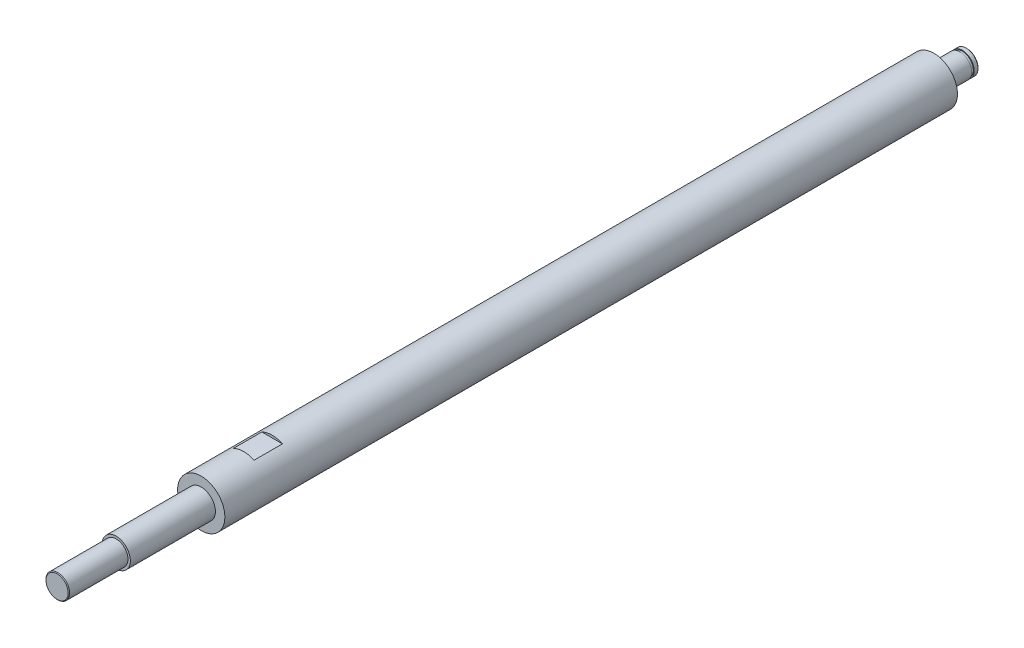
ISO-10303-21;
HEADER;
FILE_DESCRIPTION(('STEP AP214'),'2;1');
FILE_NAME('part.step','',(''),(''),'','','');
FILE_SCHEMA(('AUTOMOTIVE_DESIGN { 1 0 10303 214 1 1 1 1 }'));
ENDSEC;
DATA;
#1=APPLICATION_CONTEXT('core data for automotive mechanical design processes');
#2=APPLICATION_PROTOCOL_DEFINITION('international standard','automotive_design',2000,#1);
#3=PRODUCT_CONTEXT('',#1,'mechanical');
#4=PRODUCT('Part','Part','',(#3));
#5=PRODUCT_RELATED_PRODUCT_CATEGORY('part','',(#4));
#6=PRODUCT_DEFINITION_FORMATION('','',#4);
#7=PRODUCT_DEFINITION_CONTEXT('part definition',#1,'design');
#8=PRODUCT_DEFINITION('design','',#6,#7);
#9=PRODUCT_DEFINITION_SHAPE('','',#8);
#10=(LENGTH_UNIT() NAMED_UNIT(*) SI_UNIT(.MILLI.,.METRE.));
#11=(NAMED_UNIT(*) PLANE_ANGLE_UNIT() SI_UNIT($,.RADIAN.));
#12=(NAMED_UNIT(*) SI_UNIT($,.STERADIAN.) SOLID_ANGLE_UNIT());
#13=UNCERTAINTY_MEASURE_WITH_UNIT(LENGTH_MEASURE(1.E-05),#10,'distance_accuracy_value','');
#14=(GEOMETRIC_REPRESENTATION_CONTEXT(3) GLOBAL_UNCERTAINTY_ASSIGNED_CONTEXT((#13)) GLOBAL_UNIT_ASSIGNED_CONTEXT((#10,
#11,#12)) REPRESENTATION_CONTEXT('',''));
#15=CARTESIAN_POINT('',(0.,0.,0.));
#16=DIRECTION('',(0.,0.,1.));
#17=DIRECTION('',(1.,0.,0.));
#18=AXIS2_PLACEMENT_3D('',#15,#16,#17);
#19=CARTESIAN_POINT('',(0.,0.,360.));
#20=DIRECTION('',(0.,0.,1.));
#21=DIRECTION('',(1.,0.,0.));
#22=AXIS2_PLACEMENT_3D('',#19,#20,#21);
#23=PLANE('',#22);
#24=CARTESIAN_POINT('',(0.,0.,360.));
#25=DIRECTION('',(0.,0.,1.));
#26=DIRECTION('',(1.,0.,0.));
#27=AXIS2_PLACEMENT_3D('',#24,#25,#26);
#28=CIRCLE('',#27,6.);
#29=CARTESIAN_POINT('',(5.99999999999994,0.,360.));
#30=VERTEX_POINT('',#29);
#31=EDGE_CURVE('E314',#30,#30,#28,.T.);
#32=ORIENTED_EDGE('',*,*,#31,.T.);
#33=EDGE_LOOP('',(#32));
#34=FACE_BOUND('',#33,.T.);
#35=CARTESIAN_POINT('',(0.,0.,360.));
#36=DIRECTION('',(0.,0.,1.));
#37=DIRECTION('',(1.,0.,0.));
#38=AXIS2_PLACEMENT_3D('',#35,#36,#37);
#39=CIRCLE('',#38,5.);
#40=CARTESIAN_POINT('',(4.99999999999994,0.,360.));
#41=VERTEX_POINT('',#40);
#42=EDGE_CURVE('E310',#41,#41,#39,.T.);
#43=ORIENTED_EDGE('',*,*,#42,.F.);
#44=EDGE_LOOP('',(#43));
#45=FACE_BOUND('',#44,.T.);
#46=ADVANCED_FACE('F17',(#34,#45),#23,.T.);
#47=CARTESIAN_POINT('',(0.,0.,324.));
#48=DIRECTION('',(0.,0.,1.));
#49=DIRECTION('',(1.,0.,0.));
#50=AXIS2_PLACEMENT_3D('',#47,#48,#49);
#51=PLANE('',#50);
#52=CARTESIAN_POINT('',(0.,0.,324.));
#53=DIRECTION('',(0.,0.,1.));
#54=DIRECTION('',(1.,0.,0.));
#55=AXIS2_PLACEMENT_3D('',#52,#53,#54);
#56=CIRCLE('',#55,10.);
#57=CARTESIAN_POINT('',(9.99999999999994,0.,324.));
#58=VERTEX_POINT('',#57);
#59=EDGE_CURVE('E319',#58,#58,#56,.T.);
#60=ORIENTED_EDGE('',*,*,#59,.T.);
#61=EDGE_LOOP('',(#60));
#62=FACE_BOUND('',#61,.T.);
#63=CARTESIAN_POINT('',(0.,0.,324.));
#64=DIRECTION('',(0.,0.,1.));
#65=DIRECTION('',(1.,0.,0.));
#66=AXIS2_PLACEMENT_3D('',#63,#64,#65);
#67=CIRCLE('',#66,6.);
#68=CARTESIAN_POINT('',(5.99999999999995,0.,324.));
#69=VERTEX_POINT('',#68);
#70=EDGE_CURVE('E313',#69,#69,#67,.T.);
#71=ORIENTED_EDGE('',*,*,#70,.F.);
#72=EDGE_LOOP('',(#71));
#73=FACE_BOUND('',#72,.T.);
#74=ADVANCED_FACE('F101',(#62,#73),#51,.T.);
#75=CARTESIAN_POINT('',(0.,0.,1.9));
#76=DIRECTION('',(0.,0.,1.));
#77=DIRECTION('',(1.,0.,0.));
#78=AXIS2_PLACEMENT_3D('',#75,#76,#77);
#79=PLANE('',#78);
#80=CARTESIAN_POINT('',(0.,0.,1.9));
#81=DIRECTION('',(0.,0.,1.));
#82=DIRECTION('',(1.,0.,0.));
#83=AXIS2_PLACEMENT_3D('',#80,#81,#82);
#84=CIRCLE('',#83,5.);
#85=CARTESIAN_POINT('',(5.,0.,1.9));
#86=VERTEX_POINT('',#85);
#87=EDGE_CURVE('E334',#86,#86,#84,.T.);
#88=ORIENTED_EDGE('',*,*,#87,.T.);
#89=EDGE_LOOP('',(#88));
#90=FACE_BOUND('',#89,.T.);
#91=CARTESIAN_POINT('',(0.,0.,1.9));
#92=DIRECTION('',(0.,0.,1.));
#93=DIRECTION('',(1.,0.,0.));
#94=AXIS2_PLACEMENT_3D('',#91,#92,#93);
#95=CIRCLE('',#94,4.65);
#96=CARTESIAN_POINT('',(4.65,0.,1.9));
#97=VERTEX_POINT('',#96);
#98=EDGE_CURVE('E328',#97,#97,#95,.T.);
#99=ORIENTED_EDGE('',*,*,#98,.F.);
#100=EDGE_LOOP('',(#99));
#101=FACE_BOUND('',#100,.T.);
#102=ADVANCED_FACE('F107',(#90,#101),#79,.T.);
#103=CARTESIAN_POINT('',(0.,0.,1.9));
#104=DIRECTION('',(0.,0.,-1.));
#105=DIRECTION('',(-1.,0.,0.));
#106=AXIS2_PLACEMENT_3D('',#103,#104,#105);
#107=CYLINDRICAL_SURFACE('',#106,5.);
#108=CARTESIAN_POINT('',(0.,0.,0.300000000000189));
#109=DIRECTION('',(0.,0.,1.));
#110=DIRECTION('',(1.,0.,0.));
#111=AXIS2_PLACEMENT_3D('',#108,#109,#110);
#112=CIRCLE('',#111,5.);
#113=CARTESIAN_POINT('',(5.,0.,0.300000000000188));
#114=VERTEX_POINT('',#113);
#115=EDGE_CURVE('E25',#114,#114,#112,.T.);
#116=ORIENTED_EDGE('',*,*,#115,.T.);
#117=EDGE_LOOP('',(#116));
#118=FACE_BOUND('',#117,.T.);
#119=ORIENTED_EDGE('',*,*,#87,.F.);
#120=EDGE_LOOP('',(#119));
#121=FACE_BOUND('',#120,.T.);
#122=ADVANCED_FACE('F88',(#118,#121),#107,.T.);
#123=CARTESIAN_POINT('',(0.,0.,0.));
#124=DIRECTION('',(0.,0.,1.));
#125=DIRECTION('',(1.,0.,0.));
#126=AXIS2_PLACEMENT_3D('',#123,#124,#125);
#127=PLANE('',#126);
#128=CARTESIAN_POINT('',(0.,0.,0.));
#129=DIRECTION('',(0.,0.,1.));
#130=DIRECTION('',(1.,0.,0.));
#131=AXIS2_PLACEMENT_3D('',#128,#129,#130);
#132=CIRCLE('',#131,4.69999999999976);
#133=CARTESIAN_POINT('',(4.69999999999976,0.,0.));
#134=VERTEX_POINT('',#133);
#135=EDGE_CURVE('E11',#134,#134,#132,.F.);
#136=ORIENTED_EDGE('',*,*,#135,.T.);
#137=EDGE_LOOP('',(#136));
#138=FACE_BOUND('',#137,.T.);
#139=ADVANCED_FACE('F137',(#138),#127,.F.);
#140=CARTESIAN_POINT('',(0.,0.,3.));
#141=DIRECTION('',(0.,0.,-1.));
#142=DIRECTION('',(-1.,0.,0.));
#143=AXIS2_PLACEMENT_3D('',#140,#141,#142);
#144=CYLINDRICAL_SURFACE('',#143,4.65);
#145=CARTESIAN_POINT('',(0.,0.,3.));
#146=DIRECTION('',(0.,0.,1.));
#147=DIRECTION('',(1.,0.,0.));
#148=AXIS2_PLACEMENT_3D('',#145,#146,#147);
#149=CIRCLE('',#148,4.65);
#150=CARTESIAN_POINT('',(4.65,0.,3.));
#151=VERTEX_POINT('',#150);
#152=EDGE_CURVE('E331',#151,#151,#149,.T.);
#153=ORIENTED_EDGE('',*,*,#152,.F.);
#154=EDGE_LOOP('',(#153));
#155=FACE_BOUND('',#154,.T.);
#156=ORIENTED_EDGE('',*,*,#98,.T.);
#157=EDGE_LOOP('',(#156));
#158=FACE_BOUND('',#157,.T.);
#159=ADVANCED_FACE('F130',(#155,#158),#144,.T.);
#160=CARTESIAN_POINT('',(0.,0.,3.));
#161=DIRECTION('',(0.,0.,1.));
#162=DIRECTION('',(1.,0.,0.));
#163=AXIS2_PLACEMENT_3D('',#160,#161,#162);
#164=PLANE('',#163);
#165=CARTESIAN_POINT('',(0.,0.,3.));
#166=DIRECTION('',(0.,0.,1.));
#167=DIRECTION('',(1.,0.,0.));
#168=AXIS2_PLACEMENT_3D('',#165,#166,#167);
#169=CIRCLE('',#168,5.);
#170=CARTESIAN_POINT('',(5.,0.,3.));
#171=VERTEX_POINT('',#170);
#172=EDGE_CURVE('E322',#171,#171,#169,.T.);
#173=ORIENTED_EDGE('',*,*,#172,.F.);
#174=EDGE_LOOP('',(#173));
#175=FACE_BOUND('',#174,.T.);
#176=ORIENTED_EDGE('',*,*,#152,.T.);
#177=EDGE_LOOP('',(#176));
#178=FACE_BOUND('',#177,.T.);
#179=ADVANCED_FACE('F127',(#175,#178),#164,.F.);
#180=CARTESIAN_POINT('',(0.,0.,14.));
#181=DIRECTION('',(0.,0.,-1.));
#182=DIRECTION('',(-1.,0.,0.));
#183=AXIS2_PLACEMENT_3D('',#180,#181,#182);
#184=CYLINDRICAL_SURFACE('',#183,5.);
#185=CARTESIAN_POINT('',(0.,0.,14.));
#186=DIRECTION('',(0.,0.,1.));
#187=DIRECTION('',(1.,0.,0.));
#188=AXIS2_PLACEMENT_3D('',#185,#186,#187);
#189=CIRCLE('',#188,5.);
#190=CARTESIAN_POINT('',(5.,0.,14.));
#191=VERTEX_POINT('',#190);
#192=EDGE_CURVE('E325',#191,#191,#189,.T.);
#193=ORIENTED_EDGE('',*,*,#192,.F.);
#194=EDGE_LOOP('',(#193));
#195=FACE_BOUND('',#194,.T.);
#196=ORIENTED_EDGE('',*,*,#172,.T.);
#197=EDGE_LOOP('',(#196));
#198=FACE_BOUND('',#197,.T.);
#199=ADVANCED_FACE('F123',(#195,#198),#184,.T.);
#200=CARTESIAN_POINT('',(0.,0.,14.));
#201=DIRECTION('',(0.,0.,1.));
#202=DIRECTION('',(1.,0.,0.));
#203=AXIS2_PLACEMENT_3D('',#200,#201,#202);
#204=PLANE('',#203);
#205=CARTESIAN_POINT('',(0.,0.,14.));
#206=DIRECTION('',(0.,0.,1.));
#207=DIRECTION('',(1.,0.,0.));
#208=AXIS2_PLACEMENT_3D('',#205,#206,#207);
#209=CIRCLE('',#208,10.);
#210=CARTESIAN_POINT('',(10.,0.,14.));
#211=VERTEX_POINT('',#210);
#212=EDGE_CURVE('E316',#211,#211,#209,.T.);
#213=ORIENTED_EDGE('',*,*,#212,.F.);
#214=EDGE_LOOP('',(#213));
#215=FACE_BOUND('',#214,.T.);
#216=ORIENTED_EDGE('',*,*,#192,.T.);
#217=EDGE_LOOP('',(#216));
#218=FACE_BOUND('',#217,.T.);
#219=ADVANCED_FACE('F120',(#215,#218),#204,.F.);
#220=CARTESIAN_POINT('',(0.,0.,324.));
#221=DIRECTION('',(0.,0.,-1.));
#222=DIRECTION('',(-1.,0.,0.));
#223=AXIS2_PLACEMENT_3D('',#220,#221,#222);
#224=CYLINDRICAL_SURFACE('',#223,10.);
#225=CARTESIAN_POINT('',(0.,0.,306.));
#226=DIRECTION('',(0.,0.,-1.));
#227=DIRECTION('',(-1.,0.,0.));
#228=AXIS2_PLACEMENT_3D('',#225,#226,#227);
#229=CIRCLE('',#228,10.);
#230=CARTESIAN_POINT('',(-4.35889894354073,9.,306.));
#231=VERTEX_POINT('',#230);
#232=CARTESIAN_POINT('',(4.35889894354063,9.,306.));
#233=VERTEX_POINT('',#232);
#234=EDGE_CURVE('E69',#231,#233,#229,.T.);
#235=ORIENTED_EDGE('',*,*,#234,.F.);
#236=DIRECTION('',(0.,0.,-1.));
#237=VECTOR('',#236,1.);
#238=CARTESIAN_POINT('',(-4.35889894354073,9.,324.));
#239=LINE('',#238,#237);
#240=CARTESIAN_POINT('',(-4.35889894354073,9.,294.));
#241=VERTEX_POINT('',#240);
#242=EDGE_CURVE('E57',#231,#241,#239,.T.);
#243=ORIENTED_EDGE('',*,*,#242,.T.);
#244=CARTESIAN_POINT('',(0.,0.,294.));
#245=DIRECTION('',(0.,0.,1.));
#246=DIRECTION('',(1.,0.,0.));
#247=AXIS2_PLACEMENT_3D('',#244,#245,#246);
#248=CIRCLE('',#247,10.);
#249=CARTESIAN_POINT('',(4.35889894354063,9.,294.));
#250=VERTEX_POINT('',#249);
#251=EDGE_CURVE('E65',#250,#241,#248,.T.);
#252=ORIENTED_EDGE('',*,*,#251,.F.);
#253=DIRECTION('',(0.,0.,-1.));
#254=VECTOR('',#253,1.);
#255=CARTESIAN_POINT('',(4.35889894354063,9.,324.));
#256=LINE('',#255,#254);
#257=EDGE_CURVE('E74',#250,#233,#256,.F.);
#258=ORIENTED_EDGE('',*,*,#257,.T.);
#259=EDGE_LOOP('',(#235,#243,#252,#258));
#260=FACE_BOUND('',#259,.T.);
#261=CARTESIAN_POINT('',(0.,0.,306.));
#262=DIRECTION('',(0.,0.,1.));
#263=DIRECTION('',(1.,0.,0.));
#264=AXIS2_PLACEMENT_3D('',#261,#262,#263);
#265=CIRCLE('',#264,10.);
#266=CARTESIAN_POINT('',(-4.35889894354073,-9.,306.));
#267=VERTEX_POINT('',#266);
#268=CARTESIAN_POINT('',(4.35889894354063,-9.,306.));
#269=VERTEX_POINT('',#268);
#270=EDGE_CURVE('E345',#267,#269,#265,.T.);
#271=ORIENTED_EDGE('',*,*,#270,.T.);
#272=DIRECTION('',(0.,0.,-1.));
#273=VECTOR('',#272,1.);
#274=CARTESIAN_POINT('',(4.35889894354063,-9.,324.));
#275=LINE('',#274,#273);
#276=CARTESIAN_POINT('',(4.35889894354063,-9.,294.));
#277=VERTEX_POINT('',#276);
#278=EDGE_CURVE('E77',#269,#277,#275,.T.);
#279=ORIENTED_EDGE('',*,*,#278,.T.);
#280=CARTESIAN_POINT('',(0.,0.,294.));
#281=DIRECTION('',(0.,0.,-1.));
#282=DIRECTION('',(-1.,0.,0.));
#283=AXIS2_PLACEMENT_3D('',#280,#281,#282);
#284=CIRCLE('',#283,10.);
#285=CARTESIAN_POINT('',(-4.35889894354073,-9.,294.));
#286=VERTEX_POINT('',#285);
#287=EDGE_CURVE('E342',#277,#286,#284,.T.);
#288=ORIENTED_EDGE('',*,*,#287,.T.);
#289=DIRECTION('',(0.,0.,-1.));
#290=VECTOR('',#289,1.);
#291=CARTESIAN_POINT('',(-4.35889894354073,-9.,324.));
#292=LINE('',#291,#290);
#293=EDGE_CURVE('E339',#286,#267,#292,.F.);
#294=ORIENTED_EDGE('',*,*,#293,.T.);
#295=EDGE_LOOP('',(#271,#279,#288,#294));
#296=FACE_BOUND('',#295,.T.);
#297=ORIENTED_EDGE('',*,*,#59,.F.);
#298=EDGE_LOOP('',(#297));
#299=FACE_BOUND('',#298,.T.);
#300=ORIENTED_EDGE('',*,*,#212,.T.);
#301=EDGE_LOOP('',(#300));
#302=FACE_BOUND('',#301,.T.);
#303=ADVANCED_FACE('F72',(#260,#296,#299,#302),#224,.T.);
#304=CARTESIAN_POINT('',(0.,0.,360.));
#305=DIRECTION('',(0.,0.,-1.));
#306=DIRECTION('',(-1.,0.,0.));
#307=AXIS2_PLACEMENT_3D('',#304,#305,#306);
#308=CYLINDRICAL_SURFACE('',#307,6.);
#309=ORIENTED_EDGE('',*,*,#31,.F.);
#310=EDGE_LOOP('',(#309));
#311=FACE_BOUND('',#310,.T.);
#312=ORIENTED_EDGE('',*,*,#70,.T.);
#313=EDGE_LOOP('',(#312));
#314=FACE_BOUND('',#313,.T.);
#315=ADVANCED_FACE('F116',(#311,#314),#308,.T.);
#316=CARTESIAN_POINT('',(0.,0.,385.));
#317=DIRECTION('',(0.,0.,-1.));
#318=DIRECTION('',(-1.,0.,0.));
#319=AXIS2_PLACEMENT_3D('',#316,#317,#318);
#320=CYLINDRICAL_SURFACE('',#319,5.);
#321=CARTESIAN_POINT('',(0.,0.,384.7));
#322=DIRECTION('',(0.,0.,1.));
#323=DIRECTION('',(1.,0.,0.));
#324=AXIS2_PLACEMENT_3D('',#321,#322,#323);
#325=CIRCLE('',#324,5.);
#326=CARTESIAN_POINT('',(4.99999999999993,0.,384.7));
#327=VERTEX_POINT('',#326);
#328=EDGE_CURVE('E83',#327,#327,#325,.F.);
#329=ORIENTED_EDGE('',*,*,#328,.T.);
#330=EDGE_LOOP('',(#329));
#331=FACE_BOUND('',#330,.T.);
#332=ORIENTED_EDGE('',*,*,#42,.T.);
#333=EDGE_LOOP('',(#332));
#334=FACE_BOUND('',#333,.T.);
#335=ADVANCED_FACE('F114',(#331,#334),#320,.T.);
#336=CARTESIAN_POINT('',(0.,0.,385.));
#337=DIRECTION('',(0.,0.,1.));
#338=DIRECTION('',(1.,0.,0.));
#339=AXIS2_PLACEMENT_3D('',#336,#337,#338);
#340=PLANE('',#339);
#341=CARTESIAN_POINT('',(0.,0.,385.));
#342=DIRECTION('',(0.,0.,1.));
#343=DIRECTION('',(1.,0.,0.));
#344=AXIS2_PLACEMENT_3D('',#341,#342,#343);
#345=CIRCLE('',#344,4.7);
#346=CARTESIAN_POINT('',(4.69999999999993,0.,385.));
#347=VERTEX_POINT('',#346);
#348=EDGE_CURVE('E64',#347,#347,#345,.T.);
#349=ORIENTED_EDGE('',*,*,#348,.T.);
#350=EDGE_LOOP('',(#349));
#351=FACE_BOUND('',#350,.T.);
#352=ADVANCED_FACE('F194',(#351),#340,.T.);
#353=CARTESIAN_POINT('',(-20.,-21.,306.));
#354=DIRECTION('',(0.,0.,1.));
#355=DIRECTION('',(1.,0.,0.));
#356=AXIS2_PLACEMENT_3D('',#353,#354,#355);
#357=PLANE('',#356);
#358=DIRECTION('',(1.,0.,0.));
#359=VECTOR('',#358,1.);
#360=CARTESIAN_POINT('',(-20.,-9.,306.));
#361=LINE('',#360,#359);
#362=EDGE_CURVE('E40',#267,#269,#361,.T.);
#363=ORIENTED_EDGE('',*,*,#362,.T.);
#364=ORIENTED_EDGE('',*,*,#270,.F.);
#365=EDGE_LOOP('',(#363,#364));
#366=FACE_BOUND('',#365,.T.);
#367=ADVANCED_FACE('F202',(#366),#357,.F.);
#368=CARTESIAN_POINT('',(-20.,-21.,294.));
#369=DIRECTION('',(0.,0.,-1.));
#370=DIRECTION('',(-1.,0.,0.));
#371=AXIS2_PLACEMENT_3D('',#368,#369,#370);
#372=PLANE('',#371);
#373=DIRECTION('',(-1.,0.,0.));
#374=VECTOR('',#373,1.);
#375=CARTESIAN_POINT('',(-20.,-9.,294.));
#376=LINE('',#375,#374);
#377=EDGE_CURVE('E304',#277,#286,#376,.T.);
#378=ORIENTED_EDGE('',*,*,#377,.T.);
#379=ORIENTED_EDGE('',*,*,#287,.F.);
#380=EDGE_LOOP('',(#378,#379));
#381=FACE_BOUND('',#380,.T.);
#382=ADVANCED_FACE('F210',(#381),#372,.F.);
#383=CARTESIAN_POINT('',(0.,-9.,0.));
#384=DIRECTION('',(0.,1.,0.));
#385=DIRECTION('',(0.,0.,1.));
#386=AXIS2_PLACEMENT_3D('',#383,#384,#385);
#387=PLANE('',#386);
#388=ORIENTED_EDGE('',*,*,#362,.F.);
#389=ORIENTED_EDGE('',*,*,#293,.F.);
#390=ORIENTED_EDGE('',*,*,#377,.F.);
#391=ORIENTED_EDGE('',*,*,#278,.F.);
#392=EDGE_LOOP('',(#388,#389,#390,#391));
#393=FACE_BOUND('',#392,.T.);
#394=ADVANCED_FACE('F219',(#393),#387,.F.);
#395=CARTESIAN_POINT('',(-20.,21.,294.));
#396=DIRECTION('',(0.,0.,1.));
#397=DIRECTION('',(1.,0.,0.));
#398=AXIS2_PLACEMENT_3D('',#395,#396,#397);
#399=PLANE('',#398);
#400=ORIENTED_EDGE('',*,*,#251,.T.);
#401=DIRECTION('',(-1.,0.,0.));
#402=VECTOR('',#401,1.);
#403=CARTESIAN_POINT('',(-20.,9.,294.));
#404=LINE('',#403,#402);
#405=EDGE_CURVE('E60',#250,#241,#404,.T.);
#406=ORIENTED_EDGE('',*,*,#405,.F.);
#407=EDGE_LOOP('',(#400,#406));
#408=FACE_BOUND('',#407,.T.);
#409=ADVANCED_FACE('F228',(#408),#399,.T.);
#410=CARTESIAN_POINT('',(-20.,21.,306.));
#411=DIRECTION('',(0.,0.,-1.));
#412=DIRECTION('',(-1.,0.,0.));
#413=AXIS2_PLACEMENT_3D('',#410,#411,#412);
#414=PLANE('',#413);
#415=ORIENTED_EDGE('',*,*,#234,.T.);
#416=DIRECTION('',(1.,0.,0.));
#417=VECTOR('',#416,1.);
#418=CARTESIAN_POINT('',(-20.,9.,306.));
#419=LINE('',#418,#417);
#420=EDGE_CURVE('E32',#231,#233,#419,.T.);
#421=ORIENTED_EDGE('',*,*,#420,.F.);
#422=EDGE_LOOP('',(#415,#421));
#423=FACE_BOUND('',#422,.T.);
#424=ADVANCED_FACE('F68',(#423),#414,.T.);
#425=CARTESIAN_POINT('',(0.,9.,0.));
#426=DIRECTION('',(0.,-1.,0.));
#427=DIRECTION('',(0.,0.,1.));
#428=AXIS2_PLACEMENT_3D('',#425,#426,#427);
#429=PLANE('',#428);
#430=ORIENTED_EDGE('',*,*,#420,.T.);
#431=ORIENTED_EDGE('',*,*,#257,.F.);
#432=ORIENTED_EDGE('',*,*,#405,.T.);
#433=ORIENTED_EDGE('',*,*,#242,.F.);
#434=EDGE_LOOP('',(#430,#431,#432,#433));
#435=FACE_BOUND('',#434,.T.);
#436=ADVANCED_FACE('F58',(#435),#429,.F.);
#437=CARTESIAN_POINT('',(0.,0.,385.));
#438=DIRECTION('',(0.,0.,-1.));
#439=DIRECTION('',(-1.,0.,0.));
#440=AXIS2_PLACEMENT_3D('',#437,#438,#439);
#441=CONICAL_SURFACE('',#440,4.7,0.785398163397441);
#442=ORIENTED_EDGE('',*,*,#328,.F.);
#443=EDGE_LOOP('',(#442));
#444=FACE_BOUND('',#443,.T.);
#445=ORIENTED_EDGE('',*,*,#348,.F.);
#446=EDGE_LOOP('',(#445));
#447=FACE_BOUND('',#446,.T.);
#448=ADVANCED_FACE('F92',(#444,#447),#441,.T.);
#449=CARTESIAN_POINT('',(0.,0.,0.300000000000189));
#450=DIRECTION('',(0.,0.,1.));
#451=DIRECTION('',(1.,0.,0.));
#452=AXIS2_PLACEMENT_3D('',#449,#450,#451);
#453=CONICAL_SURFACE('',#452,5.,0.785398163397477);
#454=ORIENTED_EDGE('',*,*,#135,.F.);
#455=EDGE_LOOP('',(#454));
#456=FACE_BOUND('',#455,.T.);
#457=ORIENTED_EDGE('',*,*,#115,.F.);
#458=EDGE_LOOP('',(#457));
#459=FACE_BOUND('',#458,.T.);
#460=ADVANCED_FACE('F19',(#456,#459),#453,.T.);
#461=CLOSED_SHELL('',(#46,#74,#102,#122,#139,#159,#179,#199,#219,#303,#315,#335,#352,#367,#382,
#394,#409,#424,#436,#448,#460));
#462=MANIFOLD_SOLID_BREP('B1',#461);
#463=ADVANCED_BREP_SHAPE_REPRESENTATION('',(#18,#462),#14);
#464=SHAPE_DEFINITION_REPRESENTATION(#9,#463);
ENDSEC;
END-ISO-10303-21;
